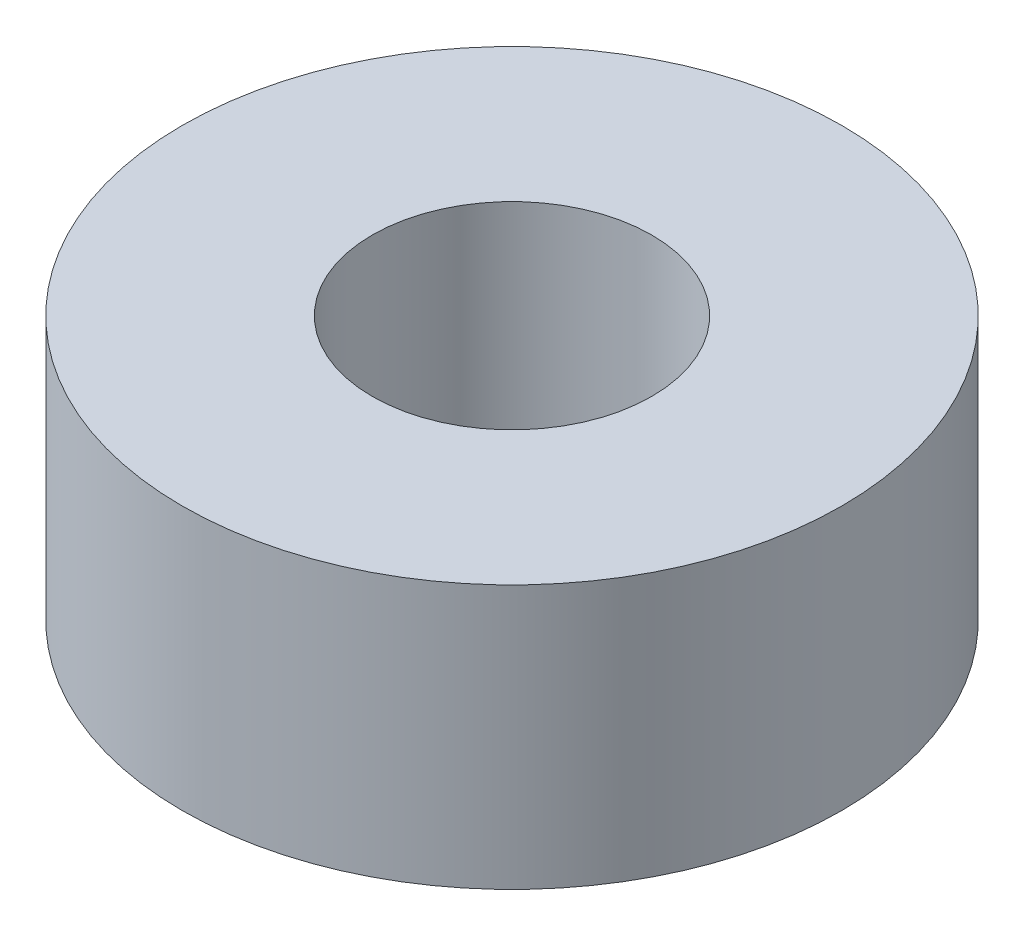
ISO-10303-21;
HEADER;
FILE_DESCRIPTION(('STEP AP214'),'2;1');
FILE_NAME('part.step','',(''),(''),'','','');
FILE_SCHEMA(('AUTOMOTIVE_DESIGN { 1 0 10303 214 1 1 1 1 }'));
ENDSEC;
DATA;
#1=APPLICATION_CONTEXT('core data for automotive mechanical design processes');
#2=APPLICATION_PROTOCOL_DEFINITION('international standard','automotive_design',2000,#1);
#3=PRODUCT_CONTEXT('',#1,'mechanical');
#4=PRODUCT('Part','Part','',(#3));
#5=PRODUCT_RELATED_PRODUCT_CATEGORY('part','',(#4));
#6=PRODUCT_DEFINITION_FORMATION('','',#4);
#7=PRODUCT_DEFINITION_CONTEXT('part definition',#1,'design');
#8=PRODUCT_DEFINITION('design','',#6,#7);
#9=PRODUCT_DEFINITION_SHAPE('','',#8);
#10=(LENGTH_UNIT() NAMED_UNIT(*) SI_UNIT(.MILLI.,.METRE.));
#11=(NAMED_UNIT(*) PLANE_ANGLE_UNIT() SI_UNIT($,.RADIAN.));
#12=(NAMED_UNIT(*) SI_UNIT($,.STERADIAN.) SOLID_ANGLE_UNIT());
#13=UNCERTAINTY_MEASURE_WITH_UNIT(LENGTH_MEASURE(1.E-05),#10,'distance_accuracy_value','');
#14=(GEOMETRIC_REPRESENTATION_CONTEXT(3) GLOBAL_UNCERTAINTY_ASSIGNED_CONTEXT((#13)) GLOBAL_UNIT_ASSIGNED_CONTEXT((#10,
#11,#12)) REPRESENTATION_CONTEXT('',''));
#15=CARTESIAN_POINT('',(0.,0.,0.));
#16=DIRECTION('',(0.,0.,1.));
#17=DIRECTION('',(1.,0.,0.));
#18=AXIS2_PLACEMENT_3D('',#15,#16,#17);
#19=CARTESIAN_POINT('',(0.,6.35,0.));
#20=DIRECTION('',(0.,1.,0.));
#21=DIRECTION('',(0.,0.,1.));
#22=AXIS2_PLACEMENT_3D('',#19,#20,#21);
#23=PLANE('',#22);
#24=CARTESIAN_POINT('',(0.,6.35,0.));
#25=DIRECTION('',(0.,1.,0.));
#26=DIRECTION('',(0.,0.,1.));
#27=AXIS2_PLACEMENT_3D('',#24,#25,#26);
#28=CIRCLE('',#27,7.9375);
#29=CARTESIAN_POINT('',(0.,6.35,7.9375));
#30=VERTEX_POINT('',#29);
#31=EDGE_CURVE('E10',#30,#30,#28,.T.);
#32=ORIENTED_EDGE('',*,*,#31,.T.);
#33=EDGE_LOOP('',(#32));
#34=FACE_BOUND('',#33,.T.);
#35=CARTESIAN_POINT('',(0.,6.35,0.));
#36=DIRECTION('',(0.,1.,0.));
#37=DIRECTION('',(0.,0.,1.));
#38=AXIS2_PLACEMENT_3D('',#35,#36,#37);
#39=CIRCLE('',#38,3.3655);
#40=CARTESIAN_POINT('',(0.,6.35,3.3655));
#41=VERTEX_POINT('',#40);
#42=EDGE_CURVE('E42',#41,#41,#39,.T.);
#43=ORIENTED_EDGE('',*,*,#42,.F.);
#44=EDGE_LOOP('',(#43));
#45=FACE_BOUND('',#44,.T.);
#46=ADVANCED_FACE('F31',(#34,#45),#23,.T.);
#47=CARTESIAN_POINT('',(0.,0.,0.));
#48=DIRECTION('',(0.,1.,0.));
#49=DIRECTION('',(0.,0.,1.));
#50=AXIS2_PLACEMENT_3D('',#47,#48,#49);
#51=PLANE('',#50);
#52=CARTESIAN_POINT('',(0.,0.,0.));
#53=DIRECTION('',(0.,1.,0.));
#54=DIRECTION('',(0.,0.,1.));
#55=AXIS2_PLACEMENT_3D('',#52,#53,#54);
#56=CIRCLE('',#55,7.9375);
#57=CARTESIAN_POINT('',(0.,0.,7.9375));
#58=VERTEX_POINT('',#57);
#59=EDGE_CURVE('E35',#58,#58,#56,.T.);
#60=ORIENTED_EDGE('',*,*,#59,.F.);
#61=EDGE_LOOP('',(#60));
#62=FACE_BOUND('',#61,.T.);
#63=CARTESIAN_POINT('',(0.,0.,0.));
#64=DIRECTION('',(0.,1.,0.));
#65=DIRECTION('',(0.,0.,1.));
#66=AXIS2_PLACEMENT_3D('',#63,#64,#65);
#67=CIRCLE('',#66,3.3655);
#68=CARTESIAN_POINT('',(0.,0.,3.3655));
#69=VERTEX_POINT('',#68);
#70=EDGE_CURVE('E44',#69,#69,#67,.T.);
#71=ORIENTED_EDGE('',*,*,#70,.T.);
#72=EDGE_LOOP('',(#71));
#73=FACE_BOUND('',#72,.T.);
#74=ADVANCED_FACE('F54',(#62,#73),#51,.F.);
#75=CARTESIAN_POINT('',(0.,6.35,0.));
#76=DIRECTION('',(0.,-1.,0.));
#77=DIRECTION('',(0.,0.,-1.));
#78=AXIS2_PLACEMENT_3D('',#75,#76,#77);
#79=CYLINDRICAL_SURFACE('',#78,7.9375);
#80=ORIENTED_EDGE('',*,*,#31,.F.);
#81=EDGE_LOOP('',(#80));
#82=FACE_BOUND('',#81,.T.);
#83=ORIENTED_EDGE('',*,*,#59,.T.);
#84=EDGE_LOOP('',(#83));
#85=FACE_BOUND('',#84,.T.);
#86=ADVANCED_FACE('F33',(#82,#85),#79,.T.);
#87=CARTESIAN_POINT('',(0.,6.35,0.));
#88=DIRECTION('',(0.,-1.,0.));
#89=DIRECTION('',(0.,0.,-1.));
#90=AXIS2_PLACEMENT_3D('',#87,#88,#89);
#91=CYLINDRICAL_SURFACE('',#90,3.3655);
#92=ORIENTED_EDGE('',*,*,#42,.T.);
#93=EDGE_LOOP('',(#92));
#94=FACE_BOUND('',#93,.T.);
#95=ORIENTED_EDGE('',*,*,#70,.F.);
#96=EDGE_LOOP('',(#95));
#97=FACE_BOUND('',#96,.T.);
#98=ADVANCED_FACE('F50',(#94,#97),#91,.F.);
#99=CLOSED_SHELL('',(#46,#74,#86,#98));
#100=MANIFOLD_SOLID_BREP('B2',#99);
#101=ADVANCED_BREP_SHAPE_REPRESENTATION('',(#18,#100),#14);
#102=SHAPE_DEFINITION_REPRESENTATION(#9,#101);
ENDSEC;
END-ISO-10303-21;
